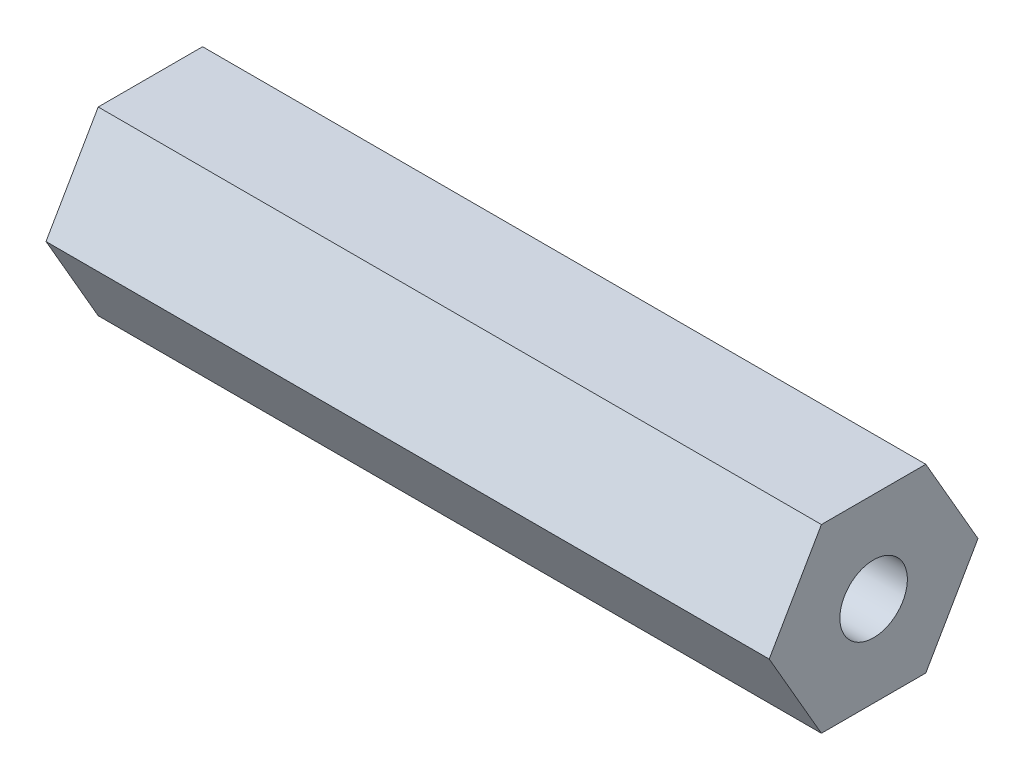
ISO-10303-21;
HEADER;
FILE_DESCRIPTION(('STEP AP214'),'2;1');
FILE_NAME('part.step','',(''),(''),'','','');
FILE_SCHEMA(('AUTOMOTIVE_DESIGN { 1 0 10303 214 1 1 1 1 }'));
ENDSEC;
DATA;
#1=APPLICATION_CONTEXT('core data for automotive mechanical design processes');
#2=APPLICATION_PROTOCOL_DEFINITION('international standard','automotive_design',2000,#1);
#3=PRODUCT_CONTEXT('',#1,'mechanical');
#4=PRODUCT('Part','Part','',(#3));
#5=PRODUCT_RELATED_PRODUCT_CATEGORY('part','',(#4));
#6=PRODUCT_DEFINITION_FORMATION('','',#4);
#7=PRODUCT_DEFINITION_CONTEXT('part definition',#1,'design');
#8=PRODUCT_DEFINITION('design','',#6,#7);
#9=PRODUCT_DEFINITION_SHAPE('','',#8);
#10=(LENGTH_UNIT() NAMED_UNIT(*) SI_UNIT(.MILLI.,.METRE.));
#11=(NAMED_UNIT(*) PLANE_ANGLE_UNIT() SI_UNIT($,.RADIAN.));
#12=(NAMED_UNIT(*) SI_UNIT($,.STERADIAN.) SOLID_ANGLE_UNIT());
#13=UNCERTAINTY_MEASURE_WITH_UNIT(LENGTH_MEASURE(1.E-05),#10,'distance_accuracy_value','');
#14=(GEOMETRIC_REPRESENTATION_CONTEXT(3) GLOBAL_UNCERTAINTY_ASSIGNED_CONTEXT((#13)) GLOBAL_UNIT_ASSIGNED_CONTEXT((#10,
#11,#12)) REPRESENTATION_CONTEXT('',''));
#15=CARTESIAN_POINT('',(0.,0.,0.));
#16=DIRECTION('',(0.,0.,1.));
#17=DIRECTION('',(1.,0.,0.));
#18=AXIS2_PLACEMENT_3D('',#15,#16,#17);
#19=CARTESIAN_POINT('',(19.05,0.,2.74963065701559));
#20=DIRECTION('',(0.,0.5,-0.866025403784439));
#21=DIRECTION('',(0.,0.866025403784438,0.5));
#22=AXIS2_PLACEMENT_3D('',#19,#20,#21);
#23=PLANE('',#22);
#24=DIRECTION('',(0.,-0.866025403784438,-0.5));
#25=VECTOR('',#24,1.);
#26=CARTESIAN_POINT('',(0.,0.,2.74963065701559));
#27=LINE('',#26,#25);
#28=CARTESIAN_POINT('',(0.,0.,2.74963065701559));
#29=VERTEX_POINT('',#28);
#30=CARTESIAN_POINT('',(0.,-2.38125,1.3748153285078));
#31=VERTEX_POINT('',#30);
#32=EDGE_CURVE('E119',#29,#31,#27,.T.);
#33=ORIENTED_EDGE('',*,*,#32,.T.);
#34=DIRECTION('',(-1.,0.,0.));
#35=VECTOR('',#34,1.);
#36=CARTESIAN_POINT('',(19.05,-2.38125,1.3748153285078));
#37=LINE('',#36,#35);
#38=CARTESIAN_POINT('',(19.05,-2.38125,1.3748153285078));
#39=VERTEX_POINT('',#38);
#40=EDGE_CURVE('E11',#39,#31,#37,.T.);
#41=ORIENTED_EDGE('',*,*,#40,.F.);
#42=DIRECTION('',(0.,-0.866025403784438,-0.5));
#43=VECTOR('',#42,1.);
#44=CARTESIAN_POINT('',(19.05,0.,2.74963065701559));
#45=LINE('',#44,#43);
#46=CARTESIAN_POINT('',(19.05,0.,2.74963065701559));
#47=VERTEX_POINT('',#46);
#48=EDGE_CURVE('E130',#47,#39,#45,.T.);
#49=ORIENTED_EDGE('',*,*,#48,.F.);
#50=DIRECTION('',(-1.,0.,0.));
#51=VECTOR('',#50,1.);
#52=CARTESIAN_POINT('',(19.05,0.,2.74963065701559));
#53=LINE('',#52,#51);
#54=EDGE_CURVE('E115',#47,#29,#53,.T.);
#55=ORIENTED_EDGE('',*,*,#54,.T.);
#56=EDGE_LOOP('',(#33,#41,#49,#55));
#57=FACE_BOUND('',#56,.T.);
#58=ADVANCED_FACE('F35',(#57),#23,.F.);
#59=CARTESIAN_POINT('',(19.05,-2.38125,1.3748153285078));
#60=DIRECTION('',(0.,1.,0.));
#61=DIRECTION('',(0.,0.,1.));
#62=AXIS2_PLACEMENT_3D('',#59,#60,#61);
#63=PLANE('',#62);
#64=DIRECTION('',(0.,0.,-1.));
#65=VECTOR('',#64,1.);
#66=CARTESIAN_POINT('',(0.,-2.38125,1.3748153285078));
#67=LINE('',#66,#65);
#68=CARTESIAN_POINT('',(0.,-2.38125,-1.3748153285078));
#69=VERTEX_POINT('',#68);
#70=EDGE_CURVE('E122',#31,#69,#67,.T.);
#71=ORIENTED_EDGE('',*,*,#70,.T.);
#72=DIRECTION('',(-1.,0.,0.));
#73=VECTOR('',#72,1.);
#74=CARTESIAN_POINT('',(19.05,-2.38125,-1.3748153285078));
#75=LINE('',#74,#73);
#76=CARTESIAN_POINT('',(19.05,-2.38125,-1.3748153285078));
#77=VERTEX_POINT('',#76);
#78=EDGE_CURVE('E43',#77,#69,#75,.T.);
#79=ORIENTED_EDGE('',*,*,#78,.F.);
#80=DIRECTION('',(0.,0.,-1.));
#81=VECTOR('',#80,1.);
#82=CARTESIAN_POINT('',(19.05,-2.38125,1.3748153285078));
#83=LINE('',#82,#81);
#84=EDGE_CURVE('E88',#39,#77,#83,.T.);
#85=ORIENTED_EDGE('',*,*,#84,.F.);
#86=ORIENTED_EDGE('',*,*,#40,.T.);
#87=EDGE_LOOP('',(#71,#79,#85,#86));
#88=FACE_BOUND('',#87,.T.);
#89=ADVANCED_FACE('F155',(#88),#63,.F.);
#90=CARTESIAN_POINT('',(19.05,-2.38125,-1.3748153285078));
#91=DIRECTION('',(0.,0.5,0.866025403784439));
#92=DIRECTION('',(0.,-0.866025403784438,0.5));
#93=AXIS2_PLACEMENT_3D('',#90,#91,#92);
#94=PLANE('',#93);
#95=DIRECTION('',(0.,0.866025403784439,-0.5));
#96=VECTOR('',#95,1.);
#97=CARTESIAN_POINT('',(0.,-2.38125,-1.3748153285078));
#98=LINE('',#97,#96);
#99=CARTESIAN_POINT('',(0.,0.,-2.74963065701559));
#100=VERTEX_POINT('',#99);
#101=EDGE_CURVE('E125',#69,#100,#98,.T.);
#102=ORIENTED_EDGE('',*,*,#101,.T.);
#103=DIRECTION('',(-1.,0.,0.));
#104=VECTOR('',#103,1.);
#105=CARTESIAN_POINT('',(19.05,0.,-2.74963065701559));
#106=LINE('',#105,#104);
#107=CARTESIAN_POINT('',(19.05,0.,-2.74963065701559));
#108=VERTEX_POINT('',#107);
#109=EDGE_CURVE('E110',#108,#100,#106,.T.);
#110=ORIENTED_EDGE('',*,*,#109,.F.);
#111=DIRECTION('',(0.,0.866025403784439,-0.5));
#112=VECTOR('',#111,1.);
#113=CARTESIAN_POINT('',(19.05,-2.38125,-1.3748153285078));
#114=LINE('',#113,#112);
#115=EDGE_CURVE('E101',#77,#108,#114,.T.);
#116=ORIENTED_EDGE('',*,*,#115,.F.);
#117=ORIENTED_EDGE('',*,*,#78,.T.);
#118=EDGE_LOOP('',(#102,#110,#116,#117));
#119=FACE_BOUND('',#118,.T.);
#120=ADVANCED_FACE('F136',(#119),#94,.F.);
#121=CARTESIAN_POINT('',(19.05,0.,-2.74963065701559));
#122=DIRECTION('',(0.,-0.5,0.866025403784438));
#123=DIRECTION('',(0.,-0.866025403784438,-0.5));
#124=AXIS2_PLACEMENT_3D('',#121,#122,#123);
#125=PLANE('',#124);
#126=DIRECTION('',(0.,0.866025403784438,0.5));
#127=VECTOR('',#126,1.);
#128=CARTESIAN_POINT('',(0.,0.,-2.74963065701559));
#129=LINE('',#128,#127);
#130=CARTESIAN_POINT('',(0.,2.38125,-1.37481532850779));
#131=VERTEX_POINT('',#130);
#132=EDGE_CURVE('E109',#100,#131,#129,.T.);
#133=ORIENTED_EDGE('',*,*,#132,.T.);
#134=DIRECTION('',(-1.,0.,0.));
#135=VECTOR('',#134,1.);
#136=CARTESIAN_POINT('',(19.05,2.38125,-1.37481532850779));
#137=LINE('',#136,#135);
#138=CARTESIAN_POINT('',(19.05,2.38125,-1.37481532850779));
#139=VERTEX_POINT('',#138);
#140=EDGE_CURVE('E106',#139,#131,#137,.T.);
#141=ORIENTED_EDGE('',*,*,#140,.F.);
#142=DIRECTION('',(0.,0.866025403784438,0.5));
#143=VECTOR('',#142,1.);
#144=CARTESIAN_POINT('',(19.05,0.,-2.74963065701559));
#145=LINE('',#144,#143);
#146=EDGE_CURVE('E95',#108,#139,#145,.T.);
#147=ORIENTED_EDGE('',*,*,#146,.F.);
#148=ORIENTED_EDGE('',*,*,#109,.T.);
#149=EDGE_LOOP('',(#133,#141,#147,#148));
#150=FACE_BOUND('',#149,.T.);
#151=ADVANCED_FACE('F107',(#150),#125,.F.);
#152=CARTESIAN_POINT('',(19.05,2.38125,-1.37481532850779));
#153=DIRECTION('',(0.,-1.,0.));
#154=DIRECTION('',(0.,0.,-1.));
#155=AXIS2_PLACEMENT_3D('',#152,#153,#154);
#156=PLANE('',#155);
#157=DIRECTION('',(0.,0.,1.));
#158=VECTOR('',#157,1.);
#159=CARTESIAN_POINT('',(0.,2.38125,-1.37481532850779));
#160=LINE('',#159,#158);
#161=CARTESIAN_POINT('',(0.,2.38125,1.3748153285078));
#162=VERTEX_POINT('',#161);
#163=EDGE_CURVE('E74',#131,#162,#160,.T.);
#164=ORIENTED_EDGE('',*,*,#163,.T.);
#165=DIRECTION('',(-1.,0.,0.));
#166=VECTOR('',#165,1.);
#167=CARTESIAN_POINT('',(19.05,2.38125,1.3748153285078));
#168=LINE('',#167,#166);
#169=CARTESIAN_POINT('',(19.05,2.38125,1.3748153285078));
#170=VERTEX_POINT('',#169);
#171=EDGE_CURVE('E111',#170,#162,#168,.T.);
#172=ORIENTED_EDGE('',*,*,#171,.F.);
#173=DIRECTION('',(0.,0.,1.));
#174=VECTOR('',#173,1.);
#175=CARTESIAN_POINT('',(19.05,2.38125,-1.37481532850779));
#176=LINE('',#175,#174);
#177=EDGE_CURVE('E99',#139,#170,#176,.T.);
#178=ORIENTED_EDGE('',*,*,#177,.F.);
#179=ORIENTED_EDGE('',*,*,#140,.T.);
#180=EDGE_LOOP('',(#164,#172,#178,#179));
#181=FACE_BOUND('',#180,.T.);
#182=ADVANCED_FACE('F113',(#181),#156,.F.);
#183=CARTESIAN_POINT('',(19.05,2.38125,1.3748153285078));
#184=DIRECTION('',(0.,-0.5,-0.866025403784439));
#185=DIRECTION('',(0.,0.866025403784439,-0.5));
#186=AXIS2_PLACEMENT_3D('',#183,#184,#185);
#187=PLANE('',#186);
#188=DIRECTION('',(0.,-0.866025403784439,0.5));
#189=VECTOR('',#188,1.);
#190=CARTESIAN_POINT('',(0.,2.38125,1.3748153285078));
#191=LINE('',#190,#189);
#192=EDGE_CURVE('E80',#162,#29,#191,.T.);
#193=ORIENTED_EDGE('',*,*,#192,.T.);
#194=ORIENTED_EDGE('',*,*,#54,.F.);
#195=DIRECTION('',(0.,-0.866025403784439,0.5));
#196=VECTOR('',#195,1.);
#197=CARTESIAN_POINT('',(19.05,2.38125,1.3748153285078));
#198=LINE('',#197,#196);
#199=EDGE_CURVE('E51',#170,#47,#198,.T.);
#200=ORIENTED_EDGE('',*,*,#199,.F.);
#201=ORIENTED_EDGE('',*,*,#171,.T.);
#202=EDGE_LOOP('',(#193,#194,#200,#201));
#203=FACE_BOUND('',#202,.T.);
#204=ADVANCED_FACE('F143',(#203),#187,.F.);
#205=CARTESIAN_POINT('',(19.05,0.,0.));
#206=DIRECTION('',(1.,0.,0.));
#207=DIRECTION('',(0.,0.,-1.));
#208=AXIS2_PLACEMENT_3D('',#205,#206,#207);
#209=PLANE('',#208);
#210=CARTESIAN_POINT('',(19.05,0.,0.));
#211=DIRECTION('',(-1.,0.,0.));
#212=DIRECTION('',(0.,0.,1.));
#213=AXIS2_PLACEMENT_3D('',#210,#211,#212);
#214=CIRCLE('',#213,0.888999999999996);
#215=CARTESIAN_POINT('',(19.05,0.,0.888999999999996));
#216=VERTEX_POINT('',#215);
#217=EDGE_CURVE('E123',#216,#216,#214,.T.);
#218=ORIENTED_EDGE('',*,*,#217,.T.);
#219=EDGE_LOOP('',(#218));
#220=FACE_BOUND('',#219,.T.);
#221=ORIENTED_EDGE('',*,*,#48,.T.);
#222=ORIENTED_EDGE('',*,*,#84,.T.);
#223=ORIENTED_EDGE('',*,*,#115,.T.);
#224=ORIENTED_EDGE('',*,*,#146,.T.);
#225=ORIENTED_EDGE('',*,*,#177,.T.);
#226=ORIENTED_EDGE('',*,*,#199,.T.);
#227=EDGE_LOOP('',(#221,#222,#223,#224,#225,#226));
#228=FACE_BOUND('',#227,.T.);
#229=ADVANCED_FACE('F97',(#220,#228),#209,.T.);
#230=CARTESIAN_POINT('',(0.,0.,0.));
#231=DIRECTION('',(1.,0.,0.));
#232=DIRECTION('',(0.,0.,-1.));
#233=AXIS2_PLACEMENT_3D('',#230,#231,#232);
#234=PLANE('',#233);
#235=CARTESIAN_POINT('',(0.,0.,0.));
#236=DIRECTION('',(-1.,0.,0.));
#237=DIRECTION('',(0.,0.,1.));
#238=AXIS2_PLACEMENT_3D('',#235,#236,#237);
#239=CIRCLE('',#238,0.888999999999987);
#240=CARTESIAN_POINT('',(0.,0.,0.888999999999987));
#241=VERTEX_POINT('',#240);
#242=EDGE_CURVE('E212',#241,#241,#239,.T.);
#243=ORIENTED_EDGE('',*,*,#242,.F.);
#244=EDGE_LOOP('',(#243));
#245=FACE_BOUND('',#244,.T.);
#246=ORIENTED_EDGE('',*,*,#32,.F.);
#247=ORIENTED_EDGE('',*,*,#192,.F.);
#248=ORIENTED_EDGE('',*,*,#163,.F.);
#249=ORIENTED_EDGE('',*,*,#132,.F.);
#250=ORIENTED_EDGE('',*,*,#101,.F.);
#251=ORIENTED_EDGE('',*,*,#70,.F.);
#252=EDGE_LOOP('',(#246,#247,#248,#249,#250,#251));
#253=FACE_BOUND('',#252,.T.);
#254=ADVANCED_FACE('F139',(#245,#253),#234,.F.);
#255=CARTESIAN_POINT('',(0.,0.,0.));
#256=DIRECTION('',(-1.,0.,0.));
#257=DIRECTION('',(0.,0.,1.));
#258=AXIS2_PLACEMENT_3D('',#255,#256,#257);
#259=CYLINDRICAL_SURFACE('',#258,0.888999999999991);
#260=ORIENTED_EDGE('',*,*,#217,.F.);
#261=EDGE_LOOP('',(#260));
#262=FACE_BOUND('',#261,.T.);
#263=ORIENTED_EDGE('',*,*,#242,.T.);
#264=EDGE_LOOP('',(#263));
#265=FACE_BOUND('',#264,.T.);
#266=ADVANCED_FACE('F192',(#262,#265),#259,.F.);
#267=CLOSED_SHELL('',(#58,#89,#120,#151,#182,#204,#229,#254,#266));
#268=MANIFOLD_SOLID_BREP('B2',#267);
#269=ADVANCED_BREP_SHAPE_REPRESENTATION('',(#18,#268),#14);
#270=SHAPE_DEFINITION_REPRESENTATION(#9,#269);
ENDSEC;
END-ISO-10303-21;
